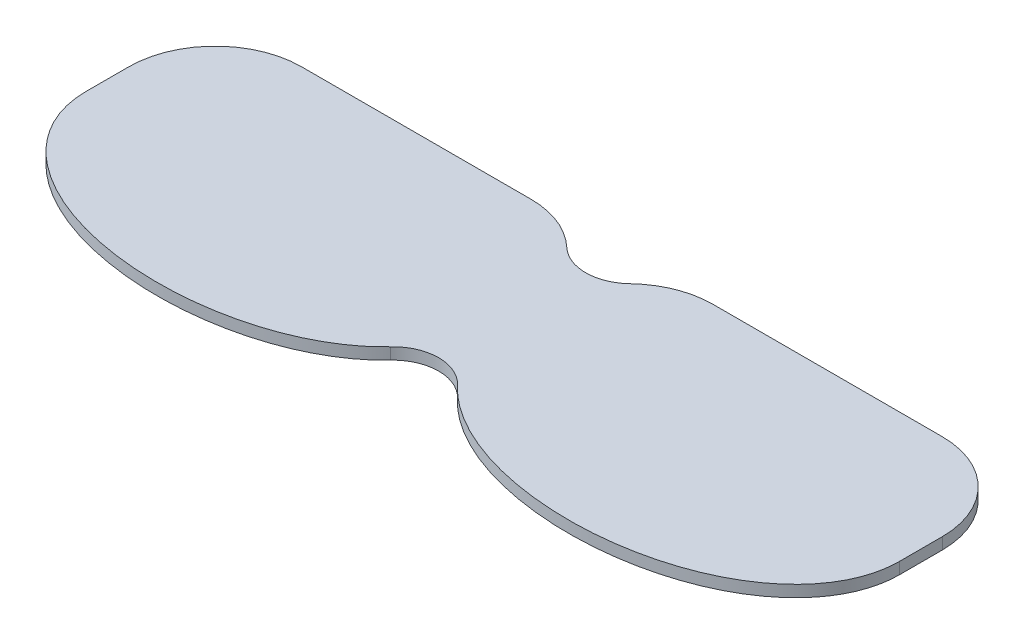
ISO-10303-21;
HEADER;
FILE_DESCRIPTION(('STEP AP214'),'2;1');
FILE_NAME('part.step','',(''),(''),'','','');
FILE_SCHEMA(('AUTOMOTIVE_DESIGN { 1 0 10303 214 1 1 1 1 }'));
ENDSEC;
DATA;
#1=APPLICATION_CONTEXT('core data for automotive mechanical design processes');
#2=APPLICATION_PROTOCOL_DEFINITION('international standard','automotive_design',2000,#1);
#3=PRODUCT_CONTEXT('',#1,'mechanical');
#4=PRODUCT('Part','Part','',(#3));
#5=PRODUCT_RELATED_PRODUCT_CATEGORY('part','',(#4));
#6=PRODUCT_DEFINITION_FORMATION('','',#4);
#7=PRODUCT_DEFINITION_CONTEXT('part definition',#1,'design');
#8=PRODUCT_DEFINITION('design','',#6,#7);
#9=PRODUCT_DEFINITION_SHAPE('','',#8);
#10=(LENGTH_UNIT() NAMED_UNIT(*) SI_UNIT(.MILLI.,.METRE.));
#11=(NAMED_UNIT(*) PLANE_ANGLE_UNIT() SI_UNIT($,.RADIAN.));
#12=(NAMED_UNIT(*) SI_UNIT($,.STERADIAN.) SOLID_ANGLE_UNIT());
#13=UNCERTAINTY_MEASURE_WITH_UNIT(LENGTH_MEASURE(1.E-05),#10,'distance_accuracy_value','');
#14=(GEOMETRIC_REPRESENTATION_CONTEXT(3) GLOBAL_UNCERTAINTY_ASSIGNED_CONTEXT((#13)) GLOBAL_UNIT_ASSIGNED_CONTEXT((#10,
#11,#12)) REPRESENTATION_CONTEXT('',''));
#15=CARTESIAN_POINT('',(0.,0.,0.));
#16=DIRECTION('',(0.,0.,1.));
#17=DIRECTION('',(1.,0.,0.));
#18=AXIS2_PLACEMENT_3D('',#15,#16,#17);
#19=CARTESIAN_POINT('',(-36.675,0.79375,-34.325));
#20=DIRECTION('',(0.,-1.,0.));
#21=DIRECTION('',(0.,0.,-1.));
#22=AXIS2_PLACEMENT_3D('',#19,#20,#21);
#23=CYLINDRICAL_SURFACE('',#22,5.675);
#24=CARTESIAN_POINT('',(-36.675,0.79375,-34.325));
#25=DIRECTION('',(0.,-1.,0.));
#26=DIRECTION('',(0.,0.,-1.));
#27=AXIS2_PLACEMENT_3D('',#24,#25,#26);
#28=CIRCLE('',#27,5.675);
#29=CARTESIAN_POINT('',(-36.675,0.79375,-40.));
#30=VERTEX_POINT('',#29);
#31=CARTESIAN_POINT('',(-32.7662824207493,0.79375,-38.4393106209493));
#32=VERTEX_POINT('',#31);
#33=EDGE_CURVE('E74',#30,#32,#28,.T.);
#34=ORIENTED_EDGE('',*,*,#33,.F.);
#35=DIRECTION('',(0.,-1.,0.));
#36=VECTOR('',#35,1.);
#37=CARTESIAN_POINT('',(-36.675,0.79375,-40.));
#38=LINE('',#37,#36);
#39=CARTESIAN_POINT('',(-36.675,1.55575,-40.));
#40=VERTEX_POINT('',#39);
#41=EDGE_CURVE('E68',#40,#30,#38,.T.);
#42=ORIENTED_EDGE('',*,*,#41,.F.);
#43=CARTESIAN_POINT('',(-36.675,1.55575,-34.325));
#44=DIRECTION('',(0.,1.,0.));
#45=DIRECTION('',(0.,0.,1.));
#46=AXIS2_PLACEMENT_3D('',#43,#44,#45);
#47=CIRCLE('',#46,5.675);
#48=CARTESIAN_POINT('',(-32.7662824207493,1.55575,-38.4393106209493));
#49=VERTEX_POINT('',#48);
#50=EDGE_CURVE('E154',#49,#40,#47,.T.);
#51=ORIENTED_EDGE('',*,*,#50,.F.);
#52=DIRECTION('',(0.,-1.,0.));
#53=VECTOR('',#52,1.);
#54=CARTESIAN_POINT('',(-32.7662824207493,0.79375,-38.4393106209493));
#55=LINE('',#54,#53);
#56=EDGE_CURVE('E158',#49,#32,#55,.T.);
#57=ORIENTED_EDGE('',*,*,#56,.T.);
#58=EDGE_LOOP('',(#34,#42,#51,#57));
#59=FACE_BOUND('',#58,.T.);
#60=ADVANCED_FACE('F61',(#59),#23,.T.);
#61=CARTESIAN_POINT('',(-36.675,0.79375,-40.));
#62=DIRECTION('',(0.,0.,1.));
#63=DIRECTION('',(1.,0.,0.));
#64=AXIS2_PLACEMENT_3D('',#61,#62,#63);
#65=PLANE('',#64);
#66=DIRECTION('',(1.,0.,0.));
#67=VECTOR('',#66,1.);
#68=CARTESIAN_POINT('',(-36.675,0.79375,-40.));
#69=LINE('',#68,#67);
#70=CARTESIAN_POINT('',(-51.725,0.79375,-40.));
#71=VERTEX_POINT('',#70);
#72=EDGE_CURVE('E219',#71,#30,#69,.T.);
#73=ORIENTED_EDGE('',*,*,#72,.F.);
#74=DIRECTION('',(0.,-1.,0.));
#75=VECTOR('',#74,1.);
#76=CARTESIAN_POINT('',(-51.725,0.79375,-40.));
#77=LINE('',#76,#75);
#78=CARTESIAN_POINT('',(-51.725,1.55575,-40.));
#79=VERTEX_POINT('',#78);
#80=EDGE_CURVE('E83',#79,#71,#77,.T.);
#81=ORIENTED_EDGE('',*,*,#80,.F.);
#82=DIRECTION('',(-1.,0.,0.));
#83=VECTOR('',#82,1.);
#84=CARTESIAN_POINT('',(-36.675,1.55575,-40.));
#85=LINE('',#84,#83);
#86=EDGE_CURVE('E157',#40,#79,#85,.T.);
#87=ORIENTED_EDGE('',*,*,#86,.F.);
#88=ORIENTED_EDGE('',*,*,#41,.T.);
#89=EDGE_LOOP('',(#73,#81,#87,#88));
#90=FACE_BOUND('',#89,.T.);
#91=ADVANCED_FACE('F205',(#90),#65,.F.);
#92=CARTESIAN_POINT('',(-51.725,0.79375,-34.325));
#93=DIRECTION('',(0.,-1.,0.));
#94=DIRECTION('',(0.,0.,-1.));
#95=AXIS2_PLACEMENT_3D('',#92,#93,#94);
#96=CYLINDRICAL_SURFACE('',#95,5.675);
#97=CARTESIAN_POINT('',(-51.725,0.79375,-34.325));
#98=DIRECTION('',(0.,-1.,0.));
#99=DIRECTION('',(0.,0.,-1.));
#100=AXIS2_PLACEMENT_3D('',#97,#98,#99);
#101=CIRCLE('',#100,5.675);
#102=CARTESIAN_POINT('',(-57.4,0.79375,-34.325));
#103=VERTEX_POINT('',#102);
#104=EDGE_CURVE('E270',#103,#71,#101,.T.);
#105=ORIENTED_EDGE('',*,*,#104,.F.);
#106=DIRECTION('',(0.,-1.,0.));
#107=VECTOR('',#106,1.);
#108=CARTESIAN_POINT('',(-57.4,0.79375,-34.325));
#109=LINE('',#108,#107);
#110=CARTESIAN_POINT('',(-57.4,1.55575,-34.325));
#111=VERTEX_POINT('',#110);
#112=EDGE_CURVE('E221',#111,#103,#109,.T.);
#113=ORIENTED_EDGE('',*,*,#112,.F.);
#114=CARTESIAN_POINT('',(-51.725,1.55575,-34.325));
#115=DIRECTION('',(0.,1.,0.));
#116=DIRECTION('',(0.,0.,1.));
#117=AXIS2_PLACEMENT_3D('',#114,#115,#116);
#118=CIRCLE('',#117,5.675);
#119=EDGE_CURVE('E218',#79,#111,#118,.T.);
#120=ORIENTED_EDGE('',*,*,#119,.F.);
#121=ORIENTED_EDGE('',*,*,#80,.T.);
#122=EDGE_LOOP('',(#105,#113,#120,#121));
#123=FACE_BOUND('',#122,.T.);
#124=ADVANCED_FACE('F210',(#123),#96,.T.);
#125=CARTESIAN_POINT('',(-57.4,0.79375,-34.325));
#126=DIRECTION('',(1.,0.,0.));
#127=DIRECTION('',(0.,0.,-1.));
#128=AXIS2_PLACEMENT_3D('',#125,#126,#127);
#129=PLANE('',#128);
#130=DIRECTION('',(0.,0.,-1.));
#131=VECTOR('',#130,1.);
#132=CARTESIAN_POINT('',(-57.4,0.79375,-34.325));
#133=LINE('',#132,#131);
#134=CARTESIAN_POINT('',(-57.4,0.79375,-31.5));
#135=VERTEX_POINT('',#134);
#136=EDGE_CURVE('E275',#135,#103,#133,.T.);
#137=ORIENTED_EDGE('',*,*,#136,.F.);
#138=DIRECTION('',(0.,-1.,0.));
#139=VECTOR('',#138,1.);
#140=CARTESIAN_POINT('',(-57.4,0.79375,-31.5));
#141=LINE('',#140,#139);
#142=CARTESIAN_POINT('',(-57.4,1.55575,-31.5));
#143=VERTEX_POINT('',#142);
#144=EDGE_CURVE('E117',#143,#135,#141,.T.);
#145=ORIENTED_EDGE('',*,*,#144,.F.);
#146=DIRECTION('',(0.,0.,1.));
#147=VECTOR('',#146,1.);
#148=CARTESIAN_POINT('',(-57.4,1.55575,-34.325));
#149=LINE('',#148,#147);
#150=EDGE_CURVE('E129',#111,#143,#149,.T.);
#151=ORIENTED_EDGE('',*,*,#150,.F.);
#152=ORIENTED_EDGE('',*,*,#112,.T.);
#153=EDGE_LOOP('',(#137,#145,#151,#152));
#154=FACE_BOUND('',#153,.T.);
#155=ADVANCED_FACE('F258',(#154),#129,.F.);
#156=CARTESIAN_POINT('',(-57.4,0.79375,-31.5));
#157=CARTESIAN_POINT('',(-57.4,0.79375,-30.8211542785592));
#158=CARTESIAN_POINT('',(-57.1531758961031,0.79375,-29.4471430814434));
#159=CARTESIAN_POINT('',(-56.1672129380606,0.79375,-27.6652704838865));
#160=CARTESIAN_POINT('',(-54.756272744858,0.79375,-26.2028137764362));
#161=CARTESIAN_POINT('',(-52.4554539835107,0.79375,-24.6429956011683));
#162=CARTESIAN_POINT('',(-48.9514289418349,0.79375,-23.3508154890305));
#163=CARTESIAN_POINT('',(-44.2,0.79375,-22.8245922554847));
#164=CARTESIAN_POINT('',(-39.4485710581651,0.79375,-23.3508154890305));
#165=CARTESIAN_POINT('',(-35.9445460164892,0.79375,-24.6429956011683));
#166=CARTESIAN_POINT('',(-34.0499031083979,0.79375,-25.9274507235496));
#167=CARTESIAN_POINT('',(-33.140035296487,0.79375,-26.7400402203476));
#168=CARTESIAN_POINT('',(-32.6582671373628,0.79375,-27.254488613723));
#169=CARTESIAN_POINT('',(-31.9565398898826,0.79375,-28.1624182814758));
#170=CARTESIAN_POINT('',(-31.2414114257777,0.79375,-29.4772741757112));
#171=CARTESIAN_POINT('',(-31.,0.79375,-30.8211542785592));
#172=CARTESIAN_POINT('',(-31.,0.79375,-31.5));
#173=B_SPLINE_CURVE_WITH_KNOTS('',3,(#156,#157,#158,#159,#160,#161,#162,#163,#164,#165,#166,
#167,#168,#169,#170,#171,#172),.UNSPECIFIED.,.F.,.F.,(4,1,1,1,1,1,1,1,1,1,1,1,1,1,4),(0.,
0.196349540849362,0.392699081698724,0.589048622548086,0.785398163397448,1.17809724509617,
1.5707963267949,1.96349540849362,2.35619449019234,2.55254403104171,2.61024302951772,
2.7084177999424,2.75750518515474,2.94524311274043,3.14159265358979),.UNSPECIFIED.);
#174=DIRECTION('',(0.,-1.,0.));
#175=VECTOR('',#174,1.);
#176=SURFACE_OF_LINEAR_EXTRUSION('',#173,#175);
#177=CARTESIAN_POINT('',(-57.4,0.79375,-31.5));
#178=CARTESIAN_POINT('',(-57.4,0.79375,-30.8211542785592));
#179=CARTESIAN_POINT('',(-57.1531758961031,0.79375,-29.4471430814434));
#180=CARTESIAN_POINT('',(-56.1672129380606,0.79375,-27.6652704838865));
#181=CARTESIAN_POINT('',(-54.756272744858,0.79375,-26.2028137764362));
#182=CARTESIAN_POINT('',(-52.4554539835107,0.79375,-24.6429956011683));
#183=CARTESIAN_POINT('',(-48.9514289418349,0.79375,-23.3508154890305));
#184=CARTESIAN_POINT('',(-44.2,0.79375,-22.8245922554847));
#185=CARTESIAN_POINT('',(-39.4485710581651,0.79375,-23.3508154890305));
#186=CARTESIAN_POINT('',(-35.9445460164892,0.79375,-24.6429956011683));
#187=CARTESIAN_POINT('',(-34.0499031083979,0.79375,-25.9274507235496));
#188=CARTESIAN_POINT('',(-33.140035296487,0.79375,-26.7400402203476));
#189=CARTESIAN_POINT('',(-32.6582671373628,0.79375,-27.254488613723));
#190=CARTESIAN_POINT('',(-31.9565398898826,0.79375,-28.1624182814758));
#191=CARTESIAN_POINT('',(-31.2414114257777,0.79375,-29.4772741757112));
#192=CARTESIAN_POINT('',(-31.,0.79375,-30.8211542785592));
#193=CARTESIAN_POINT('',(-31.,0.79375,-31.5));
#194=B_SPLINE_CURVE_WITH_KNOTS('',3,(#177,#178,#179,#180,#181,#182,#183,#184,#185,#186,#187,
#188,#189,#190,#191,#192,#193),.UNSPECIFIED.,.F.,.F.,(4,1,1,1,1,1,1,1,1,1,1,1,1,1,4),(0.,
0.196349540849362,0.392699081698724,0.589048622548086,0.785398163397448,1.17809724509617,
1.5707963267949,1.96349540849362,2.35619449019234,2.55254403104171,2.61024302951772,
2.7084177999424,2.75750518515474,2.94524311274043,3.14159265358979),.UNSPECIFIED.);
#195=CARTESIAN_POINT('',(-32.8929216775255,0.79375,-27.0112789099346));
#196=VERTEX_POINT('',#195);
#197=EDGE_CURVE('E113',#196,#135,#194,.F.);
#198=ORIENTED_EDGE('',*,*,#197,.F.);
#199=DIRECTION('',(0.,-1.,0.));
#200=VECTOR('',#199,1.);
#201=CARTESIAN_POINT('',(-32.8929216775254,0.79375,-27.0112789099346));
#202=LINE('',#201,#200);
#203=CARTESIAN_POINT('',(-32.8929216775255,1.55575,-27.0112789099345));
#204=VERTEX_POINT('',#203);
#205=EDGE_CURVE('E106',#204,#196,#202,.T.);
#206=ORIENTED_EDGE('',*,*,#205,.F.);
#207=CARTESIAN_POINT('',(-57.4,1.55575,-31.5));
#208=CARTESIAN_POINT('',(-57.3999623007137,1.55575,-31.3252708607774));
#209=CARTESIAN_POINT('',(-57.3918243320624,1.55575,-31.1506086252484));
#210=CARTESIAN_POINT('',(-57.3601097121256,1.55575,-30.802720331867));
#211=CARTESIAN_POINT('',(-57.336536426958,1.55575,-30.6294939692197));
#212=CARTESIAN_POINT('',(-57.2749227587732,1.55575,-30.2868725376511));
#213=CARTESIAN_POINT('',(-57.2369819402335,1.55575,-30.1174594161311));
#214=CARTESIAN_POINT('',(-57.1470701679043,1.55575,-29.7823962836938));
#215=CARTESIAN_POINT('',(-57.095099512376,1.55575,-29.6167461928592));
#216=CARTESIAN_POINT('',(-56.9774868771763,1.55575,-29.2906426934351));
#217=CARTESIAN_POINT('',(-56.9118640799397,1.55575,-29.1301823544744));
#218=CARTESIAN_POINT('',(-56.767992394323,1.55575,-28.8150472664316));
#219=CARTESIAN_POINT('',(-56.6897432500109,1.55575,-28.6603726347022));
#220=CARTESIAN_POINT('',(-56.5216482729126,1.55575,-28.3572029975685));
#221=CARTESIAN_POINT('',(-56.4317868639483,1.55575,-28.2087166532149));
#222=CARTESIAN_POINT('',(-56.2417054203192,1.55575,-27.9185368982846));
#223=CARTESIAN_POINT('',(-56.141484024052,1.55575,-27.7768443842054));
#224=CARTESIAN_POINT('',(-55.8867684190606,1.55575,-27.4412986348103));
#225=CARTESIAN_POINT('',(-55.7274208640722,1.55575,-27.2511124967391));
#226=CARTESIAN_POINT('',(-55.3925006278134,1.55575,-26.8856133475285));
#227=CARTESIAN_POINT('',(-55.2169223549027,1.55575,-26.7103055023012));
#228=CARTESIAN_POINT('',(-54.851962918912,1.55575,-26.3740583194901));
#229=CARTESIAN_POINT('',(-54.6625568472925,1.55575,-26.2131461340784));
#230=CARTESIAN_POINT('',(-54.2725405297848,1.55575,-25.9056050793752));
#231=CARTESIAN_POINT('',(-54.0719298227084,1.55575,-25.7589767986988));
#232=CARTESIAN_POINT('',(-53.5583100951328,1.55575,-25.4092712906654));
#233=CARTESIAN_POINT('',(-53.2394262209107,1.55575,-25.2148018939009));
#234=CARTESIAN_POINT('',(-52.5860506400821,1.55575,-24.8541379061701));
#235=CARTESIAN_POINT('',(-52.2515513530198,1.55575,-24.6879572336389));
#236=CARTESIAN_POINT('',(-51.5704056809973,1.55575,-24.3818850835421));
#237=CARTESIAN_POINT('',(-51.2237476889149,1.55575,-24.2420195850849));
#238=CARTESIAN_POINT('',(-50.5215691028626,1.55575,-23.9868887109347));
#239=CARTESIAN_POINT('',(-50.166048874664,1.55575,-23.8716223218336));
#240=CARTESIAN_POINT('',(-49.539037709294,1.55575,-23.6902091198535));
#241=CARTESIAN_POINT('',(-49.2689905251709,1.55575,-23.6190080446968));
#242=CARTESIAN_POINT('',(-48.725972207264,1.55575,-23.4887800325989));
#243=CARTESIAN_POINT('',(-48.4530007841272,1.55575,-23.4297543123328));
#244=CARTESIAN_POINT('',(-47.6304661226092,1.55575,-23.2701685587085));
#245=CARTESIAN_POINT('',(-47.0773867536247,1.55575,-23.1871295483157));
#246=CARTESIAN_POINT('',(-46.2432734764071,1.55575,-23.0957578894033));
#247=CARTESIAN_POINT('',(-45.9639035438929,1.55575,-23.0708148118588));
#248=CARTESIAN_POINT('',(-45.4043858907756,1.55575,-23.0319696017571));
#249=CARTESIAN_POINT('',(-45.1242381545942,1.55575,-23.0180676919628));
#250=CARTESIAN_POINT('',(-44.2834094964188,1.55575,-22.9928477829549));
#251=CARTESIAN_POINT('',(-43.7221273641035,1.55575,-22.9979921583824));
#252=CARTESIAN_POINT('',(-42.7789459230389,1.55575,-23.0436571667427));
#253=CARTESIAN_POINT('',(-42.3964197053069,1.55575,-23.0724828544567));
#254=CARTESIAN_POINT('',(-41.6334421566317,1.55575,-23.1510053541836));
#255=CARTESIAN_POINT('',(-41.252991002366,1.55575,-23.200703916124));
#256=CARTESIAN_POINT('',(-40.4954056759716,1.55575,-23.3216518936875));
#257=CARTESIAN_POINT('',(-40.1182724934665,1.55575,-23.392907528733));
#258=CARTESIAN_POINT('',(-39.3723487075302,1.55575,-23.5572282591912));
#259=CARTESIAN_POINT('',(-39.0035134203989,1.55575,-23.6500890404741));
#260=CARTESIAN_POINT('',(-38.2726655925702,1.55575,-23.8594283328898));
#261=CARTESIAN_POINT('',(-37.9106514226033,1.55575,-23.9759011239296));
#262=CARTESIAN_POINT('',(-37.1957914385389,1.55575,-24.2342510506902));
#263=CARTESIAN_POINT('',(-36.8429434459007,1.55575,-24.376122085526));
#264=CARTESIAN_POINT('',(-36.2746072680109,1.55575,-24.631121683492));
#265=CARTESIAN_POINT('',(-36.0554721399219,1.55575,-24.7361648541277));
#266=CARTESIAN_POINT('',(-35.6232942498862,1.55575,-24.9579152758129));
#267=CARTESIAN_POINT('',(-35.4102484642993,1.55575,-25.0746166039387));
#268=CARTESIAN_POINT('',(-34.991561664592,1.55575,-25.3202088013533));
#269=CARTESIAN_POINT('',(-34.7859134063662,1.55575,-25.449087271129));
#270=CARTESIAN_POINT('',(-34.3806169795858,1.55575,-25.7217598533578));
#271=CARTESIAN_POINT('',(-34.1810894646396,1.55575,-25.8657339782597));
#272=CARTESIAN_POINT('',(-33.7926272506553,1.55575,-26.1678346051313));
#273=CARTESIAN_POINT('',(-33.603703898891,1.55575,-26.3259758144506));
#274=CARTESIAN_POINT('',(-33.32975952645,1.55575,-26.5742924530176));
#275=CARTESIAN_POINT('',(-33.2398417636981,1.55575,-26.6591027631288));
#276=CARTESIAN_POINT('',(-33.0636014921275,1.55575,-26.832413079665));
#277=CARTESIAN_POINT('',(-32.9772797259761,1.55575,-26.9209138407868));
#278=CARTESIAN_POINT('',(-32.8929216775255,1.55575,-27.0112789099346));
#279=B_SPLINE_CURVE_WITH_KNOTS('',3,(#207,#208,#209,#210,#211,#212,#213,#214,#215,#216,#217,
#218,#219,#220,#221,#222,#223,#224,#225,#226,#227,#228,#229,#230,#231,#232,#233,#234,#235,#236,
#237,#238,#239,#240,#241,#242,#243,#244,#245,#246,#247,#248,#249,#250,#251,#252,#253,#254,#255,
#256,#257,#258,#259,#260,#261,#262,#263,#264,#265,#266,#267,#268,#269,#270,#271,#272,#273,#274,
#275,#276,#277,#278),.UNSPECIFIED.,.F.,.F.,(4,2,2,2,2,2,2,2,2,2,2,2,2,2,2,2,2,2,2,2,2,2,2,2,2,2,
2,2,2,2,2,2,2,2,2,4),(0.,0.523906082249319,1.04769794963615,1.56792455462904,2.08814010096391,
2.60762957756955,3.12712958538048,3.64733380466264,4.1676064809734,4.9108271519838,
5.65430483082275,6.39915647995763,7.14403881017296,8.26280519386121,9.38212044468083,
10.5025349836441,11.6229033560438,12.4604430998883,13.2980664980147,14.9736373978847,
15.8149139172584,16.6562074095172,18.3381450625312,19.4884880455216,20.6389274895454,
21.7896991634332,22.9300014366957,24.0700277970906,25.2097806795174,25.9385061072474,
26.6668631711345,27.3944864098923,28.132068970569,28.8704263169931,29.2411441754509,
29.6119382210761),.UNSPECIFIED.);
#280=EDGE_CURVE('E110',#143,#204,#279,.T.);
#281=ORIENTED_EDGE('',*,*,#280,.F.);
#282=ORIENTED_EDGE('',*,*,#144,.T.);
#283=EDGE_LOOP('',(#198,#206,#281,#282));
#284=FACE_BOUND('',#283,.T.);
#285=ADVANCED_FACE('F108',(#284),#176,.F.);
#286=CARTESIAN_POINT('',(-30.7,0.79375,-24.9640626252595));
#287=DIRECTION('',(0.,-1.,0.));
#288=DIRECTION('',(0.,0.,-1.));
#289=AXIS2_PLACEMENT_3D('',#286,#287,#288);
#290=CYLINDRICAL_SURFACE('',#289,3.);
#291=CARTESIAN_POINT('',(-30.7,0.79375,-24.9640626252595));
#292=DIRECTION('',(0.,-1.,0.));
#293=DIRECTION('',(0.,0.,-1.));
#294=AXIS2_PLACEMENT_3D('',#291,#292,#293);
#295=CIRCLE('',#294,3.);
#296=CARTESIAN_POINT('',(-28.5070783224744,0.79375,-27.0112789099344));
#297=VERTEX_POINT('',#296);
#298=EDGE_CURVE('E285',#297,#196,#295,.F.);
#299=ORIENTED_EDGE('',*,*,#298,.F.);
#300=DIRECTION('',(0.,-1.,0.));
#301=VECTOR('',#300,1.);
#302=CARTESIAN_POINT('',(-28.5070783224745,0.79375,-27.0112789099346));
#303=LINE('',#302,#301);
#304=CARTESIAN_POINT('',(-28.5070783224745,1.55575,-27.0112789099346));
#305=VERTEX_POINT('',#304);
#306=EDGE_CURVE('E118',#305,#297,#303,.T.);
#307=ORIENTED_EDGE('',*,*,#306,.F.);
#308=CARTESIAN_POINT('',(-30.7,1.55575,-24.9640626252595));
#309=DIRECTION('',(0.,-1.,0.));
#310=DIRECTION('',(0.,0.,1.));
#311=AXIS2_PLACEMENT_3D('',#308,#309,#310);
#312=CIRCLE('',#311,2.99999999999999);
#313=EDGE_CURVE('E126',#204,#305,#312,.T.);
#314=ORIENTED_EDGE('',*,*,#313,.F.);
#315=ORIENTED_EDGE('',*,*,#205,.T.);
#316=EDGE_LOOP('',(#299,#307,#314,#315));
#317=FACE_BOUND('',#316,.T.);
#318=ADVANCED_FACE('F131',(#317),#290,.F.);
#319=CARTESIAN_POINT('',(-30.4,0.79375,-31.5));
#320=CARTESIAN_POINT('',(-30.4,0.79375,-30.8211542785592));
#321=CARTESIAN_POINT('',(-30.1585885742223,0.79375,-29.4772741757112));
#322=CARTESIAN_POINT('',(-29.4434601101173,0.79375,-28.1624182814758));
#323=CARTESIAN_POINT('',(-28.7417328626372,0.79375,-27.254488613723));
#324=CARTESIAN_POINT('',(-28.259964703513,0.79375,-26.7400402203476));
#325=CARTESIAN_POINT('',(-27.3500968916021,0.79375,-25.9274507235495));
#326=CARTESIAN_POINT('',(-25.4554539835108,0.79375,-24.6429956011683));
#327=CARTESIAN_POINT('',(-21.9514289418349,0.79375,-23.3508154890305));
#328=CARTESIAN_POINT('',(-17.2,0.79375,-22.8245922554847));
#329=CARTESIAN_POINT('',(-12.4485710581651,0.79375,-23.3508154890305));
#330=CARTESIAN_POINT('',(-8.94454601648922,0.79375,-24.6429956011683));
#331=CARTESIAN_POINT('',(-6.64372725514197,0.79375,-26.2028137764362));
#332=CARTESIAN_POINT('',(-5.23278706193934,0.79375,-27.6652704838865));
#333=CARTESIAN_POINT('',(-4.24682410389684,0.79375,-29.4471430814434));
#334=CARTESIAN_POINT('',(-3.99999999999998,0.79375,-30.8211542785592));
#335=CARTESIAN_POINT('',(-3.99999999999998,0.79375,-31.5));
#336=B_SPLINE_CURVE_WITH_KNOTS('',3,(#319,#320,#321,#322,#323,#324,#325,#326,#327,#328,#329,
#330,#331,#332,#333,#334,#335),.UNSPECIFIED.,.F.,.F.,(4,1,1,1,1,1,1,1,1,1,1,1,1,1,4),(0.,
0.196349540849362,0.384087468435052,0.433174853647393,0.531349624072074,0.589048622548086,
0.785398163397448,1.17809724509617,1.5707963267949,1.96349540849362,2.35619449019234,
2.55254403104171,2.74889357189107,2.94524311274043,3.14159265358979),.UNSPECIFIED.);
#337=DIRECTION('',(0.,-1.,0.));
#338=VECTOR('',#337,1.);
#339=SURFACE_OF_LINEAR_EXTRUSION('',#336,#338);
#340=CARTESIAN_POINT('',(-30.4,0.79375,-31.5));
#341=CARTESIAN_POINT('',(-30.4,0.79375,-30.8211542785592));
#342=CARTESIAN_POINT('',(-30.1585885742223,0.79375,-29.4772741757112));
#343=CARTESIAN_POINT('',(-29.4434601101173,0.79375,-28.1624182814758));
#344=CARTESIAN_POINT('',(-28.7417328626372,0.79375,-27.254488613723));
#345=CARTESIAN_POINT('',(-28.259964703513,0.79375,-26.7400402203476));
#346=CARTESIAN_POINT('',(-27.3500968916021,0.79375,-25.9274507235495));
#347=CARTESIAN_POINT('',(-25.4554539835108,0.79375,-24.6429956011683));
#348=CARTESIAN_POINT('',(-21.9514289418349,0.79375,-23.3508154890305));
#349=CARTESIAN_POINT('',(-17.2,0.79375,-22.8245922554847));
#350=CARTESIAN_POINT('',(-12.4485710581651,0.79375,-23.3508154890305));
#351=CARTESIAN_POINT('',(-8.94454601648922,0.79375,-24.6429956011683));
#352=CARTESIAN_POINT('',(-6.64372725514197,0.79375,-26.2028137764362));
#353=CARTESIAN_POINT('',(-5.23278706193934,0.79375,-27.6652704838865));
#354=CARTESIAN_POINT('',(-4.24682410389684,0.79375,-29.4471430814434));
#355=CARTESIAN_POINT('',(-3.99999999999998,0.79375,-30.8211542785592));
#356=CARTESIAN_POINT('',(-3.99999999999998,0.79375,-31.5));
#357=B_SPLINE_CURVE_WITH_KNOTS('',3,(#340,#341,#342,#343,#344,#345,#346,#347,#348,#349,#350,
#351,#352,#353,#354,#355,#356),.UNSPECIFIED.,.F.,.F.,(4,1,1,1,1,1,1,1,1,1,1,1,1,1,4),(0.,
0.196349540849362,0.384087468435052,0.433174853647393,0.531349624072074,0.589048622548086,
0.785398163397448,1.17809724509617,1.5707963267949,1.96349540849362,2.35619449019234,
2.55254403104171,2.74889357189107,2.94524311274043,3.14159265358979),.UNSPECIFIED.);
#358=CARTESIAN_POINT('',(-3.99999999999998,0.79375,-31.5));
#359=VERTEX_POINT('',#358);
#360=EDGE_CURVE('E291',#359,#297,#357,.F.);
#361=ORIENTED_EDGE('',*,*,#360,.F.);
#362=DIRECTION('',(0.,-1.,0.));
#363=VECTOR('',#362,1.);
#364=CARTESIAN_POINT('',(-3.99999999999998,0.79375,-31.5));
#365=LINE('',#364,#363);
#366=CARTESIAN_POINT('',(-3.99999999999998,1.55575,-31.5));
#367=VERTEX_POINT('',#366);
#368=EDGE_CURVE('E228',#367,#359,#365,.T.);
#369=ORIENTED_EDGE('',*,*,#368,.F.);
#370=CARTESIAN_POINT('',(-28.5070783224745,1.55575,-27.0112789099346));
#371=CARTESIAN_POINT('',(-28.3884443511218,1.55575,-26.8841986836925));
#372=CARTESIAN_POINT('',(-28.2659295209096,1.55575,-26.760803715622));
#373=CARTESIAN_POINT('',(-28.0142460444183,1.55575,-26.5214727065007));
#374=CARTESIAN_POINT('',(-27.8850902584292,1.55575,-26.4055231593513));
#375=CARTESIAN_POINT('',(-27.6208552286275,1.55575,-26.1807590642442));
#376=CARTESIAN_POINT('',(-27.4857792652718,1.55575,-26.0719406461925));
#377=CARTESIAN_POINT('',(-27.211546850267,1.55575,-25.8621490044408));
#378=CARTESIAN_POINT('',(-27.0724364414205,1.55575,-25.761115469672));
#379=CARTESIAN_POINT('',(-26.7895859010865,1.55575,-25.5656099049701));
#380=CARTESIAN_POINT('',(-26.6458435674505,1.55575,-25.471141065511));
#381=CARTESIAN_POINT('',(-26.3543383898513,1.55575,-25.2885553927938));
#382=CARTESIAN_POINT('',(-26.2065742811745,1.55575,-25.2004405902135));
#383=CARTESIAN_POINT('',(-25.6946758182299,1.55575,-24.9091389626558));
#384=CARTESIAN_POINT('',(-25.3220231361711,1.55575,-24.7207403349029));
#385=CARTESIAN_POINT('',(-24.561862317276,1.55575,-24.3770157568532));
#386=CARTESIAN_POINT('',(-24.1743490976412,1.55575,-24.2217012436526));
#387=CARTESIAN_POINT('',(-23.3859851474497,1.55575,-23.9406360377687));
#388=CARTESIAN_POINT('',(-22.9850645814497,1.55575,-23.8150822283784));
#389=CARTESIAN_POINT('',(-22.1754911485083,1.55575,-23.5924779989027));
#390=CARTESIAN_POINT('',(-21.7668381241263,1.55575,-23.4954281598535));
#391=CARTESIAN_POINT('',(-20.7780242819045,1.55575,-23.2941077942231));
#392=CARTESIAN_POINT('',(-20.1951930907265,1.55575,-23.2027243097596));
#393=CARTESIAN_POINT('',(-19.3168676683099,1.55575,-23.1027570617086));
#394=CARTESIAN_POINT('',(-19.0233206321732,1.55575,-23.0756166399863));
#395=CARTESIAN_POINT('',(-18.43536027417,1.55575,-23.0335393411285));
#396=CARTESIAN_POINT('',(-18.1409469749531,1.55575,-23.0186021477195));
#397=CARTESIAN_POINT('',(-17.257772614085,1.55575,-22.9920128181107));
#398=CARTESIAN_POINT('',(-16.6683252988127,1.55575,-22.9984981587256));
#399=CARTESIAN_POINT('',(-15.7863730651649,1.55575,-23.044582569847));
#400=CARTESIAN_POINT('',(-15.492776341531,1.55575,-23.0660010626683));
#401=CARTESIAN_POINT('',(-14.9067241229627,1.55575,-23.121094580299));
#402=CARTESIAN_POINT('',(-14.61426860249,1.55575,-23.1547693292243));
#403=CARTESIAN_POINT('',(-13.880201362072,1.55575,-23.2552817828047));
#404=CARTESIAN_POINT('',(-13.4396755443235,1.55575,-23.330263525398));
#405=CARTESIAN_POINT('',(-12.5647756210005,1.55575,-23.5104098538031));
#406=CARTESIAN_POINT('',(-12.1304018582279,1.55575,-23.615576114653));
#407=CARTESIAN_POINT('',(-11.2715463408567,1.55575,-23.8581695111531));
#408=CARTESIAN_POINT('',(-10.8470477511087,1.55575,-23.9955365192014));
#409=CARTESIAN_POINT('',(-10.0111571586834,1.55575,-24.3054918475502));
#410=CARTESIAN_POINT('',(-9.59975872467004,1.55575,-24.4780625669937));
#411=CARTESIAN_POINT('',(-8.94676429672025,1.55575,-24.7894331786494));
#412=CARTESIAN_POINT('',(-8.69955729377479,1.55575,-24.9164834686431));
#413=CARTESIAN_POINT('',(-8.21394260256683,1.55575,-25.1862505203341));
#414=CARTESIAN_POINT('',(-7.97553461276868,1.55575,-25.3289667445041));
#415=CARTESIAN_POINT('',(-7.27689029557292,1.55575,-25.7823621374725));
#416=CARTESIAN_POINT('',(-6.83233743177635,1.55575,-26.1187004803013));
#417=CARTESIAN_POINT('',(-6.26350831264087,1.55575,-26.6342649912314));
#418=CARTESIAN_POINT('',(-6.1106599798484,1.55575,-26.7826126526607));
#419=CARTESIAN_POINT('',(-5.81638310063665,1.55575,-27.0903278973407));
#420=CARTESIAN_POINT('',(-5.6749540307336,1.55575,-27.2496949748149));
#421=CARTESIAN_POINT('',(-5.40545515408859,1.55575,-27.5790946028017));
#422=CARTESIAN_POINT('',(-5.27737174975479,1.55575,-27.7491160092421));
#423=CARTESIAN_POINT('',(-5.03623895086168,1.55575,-28.0995274122298));
#424=CARTESIAN_POINT('',(-4.92318699903969,1.55575,-28.2799156375984));
#425=CARTESIAN_POINT('',(-4.73176112884194,1.55575,-28.6193029935693));
#426=CARTESIAN_POINT('',(-4.65075104738033,1.55575,-28.7768165653571));
#427=CARTESIAN_POINT('',(-4.50182456388289,1.55575,-29.0979322574115));
#428=CARTESIAN_POINT('',(-4.43390692536928,1.55575,-29.2615338009745));
#429=CARTESIAN_POINT('',(-4.31242982969873,1.55575,-29.5937526907887));
#430=CARTESIAN_POINT('',(-4.25885200913164,1.55575,-29.7623633118951));
#431=CARTESIAN_POINT('',(-4.16627147216282,1.55575,-30.1034906682859));
#432=CARTESIAN_POINT('',(-4.12726520955796,1.55575,-30.2760064423404));
#433=CARTESIAN_POINT('',(-4.06439184618105,1.55575,-30.6230919878517));
#434=CARTESIAN_POINT('',(-4.04046561441233,1.55575,-30.797650968184));
#435=CARTESIAN_POINT('',(-4.00829244654596,1.55575,-31.1481171350692));
#436=CARTESIAN_POINT('',(-4.00003830108536,1.55575,-31.3240236643227));
#437=CARTESIAN_POINT('',(-3.99999999999998,1.55575,-31.5));
#438=B_SPLINE_CURVE_WITH_KNOTS('',3,(#370,#371,#372,#373,#374,#375,#376,#377,#378,#379,#380,
#381,#382,#383,#384,#385,#386,#387,#388,#389,#390,#391,#392,#393,#394,#395,#396,#397,#398,#399,
#400,#401,#402,#403,#404,#405,#406,#407,#408,#409,#410,#411,#412,#413,#414,#415,#416,#417,#418,
#419,#420,#421,#422,#423,#424,#425,#426,#427,#428,#429,#430,#431,#432,#433,#434,#435,#436,#437),
.UNSPECIFIED.,.F.,.F.,(4,2,2,2,2,2,2,2,2,2,2,2,2,2,2,2,2,2,2,2,2,2,2,2,2,2,2,2,2,2,2,2,2,4),(0.,
0.521397574298677,1.04182092458314,1.56195945904667,2.07754704150844,2.59338347446494,
3.1093840388673,4.36006942593023,5.61118647265639,6.87036272816856,8.12956464943911,
9.89684900032871,10.7810424802135,11.6652130435559,13.4312911340659,14.3142241424724,
15.1971372775909,16.5366864852697,17.8763100433051,19.2134518081176,20.5499266713147,
21.3831905275275,22.2164258018407,23.8799581450592,24.5185347177704,25.1570820001069,
25.7949721849947,26.4327537080134,26.9635890599592,27.4943742541136,28.024476442709,
28.5544495389601,29.082331388984,29.6099703476222),.UNSPECIFIED.);
#439=EDGE_CURVE('E133',#305,#367,#438,.T.);
#440=ORIENTED_EDGE('',*,*,#439,.F.);
#441=ORIENTED_EDGE('',*,*,#306,.T.);
#442=EDGE_LOOP('',(#361,#369,#440,#441));
#443=FACE_BOUND('',#442,.T.);
#444=ADVANCED_FACE('F169',(#443),#339,.F.);
#445=CARTESIAN_POINT('',(-3.99999999999998,0.79375,-31.5));
#446=DIRECTION('',(-1.,0.,0.));
#447=DIRECTION('',(0.,0.,1.));
#448=AXIS2_PLACEMENT_3D('',#445,#446,#447);
#449=PLANE('',#448);
#450=DIRECTION('',(0.,0.,1.));
#451=VECTOR('',#450,1.);
#452=CARTESIAN_POINT('',(-3.99999999999998,0.79375,-31.5));
#453=LINE('',#452,#451);
#454=CARTESIAN_POINT('',(-3.99999999999999,0.79375,-34.325));
#455=VERTEX_POINT('',#454);
#456=EDGE_CURVE('E296',#455,#359,#453,.T.);
#457=ORIENTED_EDGE('',*,*,#456,.F.);
#458=DIRECTION('',(0.,-1.,0.));
#459=VECTOR('',#458,1.);
#460=CARTESIAN_POINT('',(-3.99999999999999,0.79375,-34.325));
#461=LINE('',#460,#459);
#462=CARTESIAN_POINT('',(-3.99999999999999,1.55575,-34.325));
#463=VERTEX_POINT('',#462);
#464=EDGE_CURVE('E231',#463,#455,#461,.T.);
#465=ORIENTED_EDGE('',*,*,#464,.F.);
#466=DIRECTION('',(0.,0.,-1.));
#467=VECTOR('',#466,1.);
#468=CARTESIAN_POINT('',(-3.99999999999998,1.55575,-31.5));
#469=LINE('',#468,#467);
#470=EDGE_CURVE('E135',#367,#463,#469,.T.);
#471=ORIENTED_EDGE('',*,*,#470,.F.);
#472=ORIENTED_EDGE('',*,*,#368,.T.);
#473=EDGE_LOOP('',(#457,#465,#471,#472));
#474=FACE_BOUND('',#473,.T.);
#475=ADVANCED_FACE('F195',(#474),#449,.F.);
#476=CARTESIAN_POINT('',(-9.67499999999999,0.79375,-34.325));
#477=DIRECTION('',(0.,-1.,0.));
#478=DIRECTION('',(0.,0.,-1.));
#479=AXIS2_PLACEMENT_3D('',#476,#477,#478);
#480=CYLINDRICAL_SURFACE('',#479,5.67500000000001);
#481=CARTESIAN_POINT('',(-9.67499999999999,0.79375,-34.325));
#482=DIRECTION('',(0.,-1.,0.));
#483=DIRECTION('',(0.,0.,-1.));
#484=AXIS2_PLACEMENT_3D('',#481,#482,#483);
#485=CIRCLE('',#484,5.67500000000001);
#486=CARTESIAN_POINT('',(-9.67499999999999,0.79375,-40.));
#487=VERTEX_POINT('',#486);
#488=EDGE_CURVE('E302',#487,#455,#485,.T.);
#489=ORIENTED_EDGE('',*,*,#488,.F.);
#490=DIRECTION('',(0.,-1.,0.));
#491=VECTOR('',#490,1.);
#492=CARTESIAN_POINT('',(-9.67499999999999,0.79375,-40.));
#493=LINE('',#492,#491);
#494=CARTESIAN_POINT('',(-9.67499999999999,1.55575,-40.));
#495=VERTEX_POINT('',#494);
#496=EDGE_CURVE('E234',#495,#487,#493,.T.);
#497=ORIENTED_EDGE('',*,*,#496,.F.);
#498=CARTESIAN_POINT('',(-9.67499999999999,1.55575,-34.325));
#499=DIRECTION('',(0.,1.,0.));
#500=DIRECTION('',(0.,0.,1.));
#501=AXIS2_PLACEMENT_3D('',#498,#499,#500);
#502=CIRCLE('',#501,5.67500000000001);
#503=EDGE_CURVE('E142',#463,#495,#502,.T.);
#504=ORIENTED_EDGE('',*,*,#503,.F.);
#505=ORIENTED_EDGE('',*,*,#464,.T.);
#506=EDGE_LOOP('',(#489,#497,#504,#505));
#507=FACE_BOUND('',#506,.T.);
#508=ADVANCED_FACE('F192',(#507),#480,.T.);
#509=CARTESIAN_POINT('',(-9.67499999999999,0.79375,-40.));
#510=DIRECTION('',(0.,0.,1.));
#511=DIRECTION('',(1.,0.,0.));
#512=AXIS2_PLACEMENT_3D('',#509,#510,#511);
#513=PLANE('',#512);
#514=DIRECTION('',(1.,0.,0.));
#515=VECTOR('',#514,1.);
#516=CARTESIAN_POINT('',(-9.67499999999999,0.79375,-40.));
#517=LINE('',#516,#515);
#518=CARTESIAN_POINT('',(-24.725,0.79375,-40.));
#519=VERTEX_POINT('',#518);
#520=EDGE_CURVE('E305',#519,#487,#517,.T.);
#521=ORIENTED_EDGE('',*,*,#520,.F.);
#522=DIRECTION('',(0.,-1.,0.));
#523=VECTOR('',#522,1.);
#524=CARTESIAN_POINT('',(-24.725,0.79375,-40.));
#525=LINE('',#524,#523);
#526=CARTESIAN_POINT('',(-24.725,1.55575,-40.));
#527=VERTEX_POINT('',#526);
#528=EDGE_CURVE('E237',#527,#519,#525,.T.);
#529=ORIENTED_EDGE('',*,*,#528,.F.);
#530=DIRECTION('',(-1.,0.,0.));
#531=VECTOR('',#530,1.);
#532=CARTESIAN_POINT('',(-9.67499999999999,1.55575,-40.));
#533=LINE('',#532,#531);
#534=EDGE_CURVE('E145',#495,#527,#533,.T.);
#535=ORIENTED_EDGE('',*,*,#534,.F.);
#536=ORIENTED_EDGE('',*,*,#496,.T.);
#537=EDGE_LOOP('',(#521,#529,#535,#536));
#538=FACE_BOUND('',#537,.T.);
#539=ADVANCED_FACE('F188',(#538),#513,.F.);
#540=CARTESIAN_POINT('',(-24.725,0.79375,-34.325));
#541=DIRECTION('',(0.,-1.,0.));
#542=DIRECTION('',(0.,0.,-1.));
#543=AXIS2_PLACEMENT_3D('',#540,#541,#542);
#544=CYLINDRICAL_SURFACE('',#543,5.67500000000001);
#545=CARTESIAN_POINT('',(-24.725,0.79375,-34.325));
#546=DIRECTION('',(0.,-1.,0.));
#547=DIRECTION('',(0.,0.,-1.));
#548=AXIS2_PLACEMENT_3D('',#545,#546,#547);
#549=CIRCLE('',#548,5.67500000000001);
#550=CARTESIAN_POINT('',(-28.6337175792507,0.79375,-38.4393106209493));
#551=VERTEX_POINT('',#550);
#552=EDGE_CURVE('E308',#551,#519,#549,.T.);
#553=ORIENTED_EDGE('',*,*,#552,.F.);
#554=DIRECTION('',(0.,-1.,0.));
#555=VECTOR('',#554,1.);
#556=CARTESIAN_POINT('',(-28.6337175792507,0.79375,-38.4393106209493));
#557=LINE('',#556,#555);
#558=CARTESIAN_POINT('',(-28.6337175792507,1.55575,-38.4393106209493));
#559=VERTEX_POINT('',#558);
#560=EDGE_CURVE('E240',#559,#551,#557,.T.);
#561=ORIENTED_EDGE('',*,*,#560,.F.);
#562=CARTESIAN_POINT('',(-24.725,1.55575,-34.325));
#563=DIRECTION('',(0.,1.,0.));
#564=DIRECTION('',(0.,0.,1.));
#565=AXIS2_PLACEMENT_3D('',#562,#563,#564);
#566=CIRCLE('',#565,5.67500000000001);
#567=EDGE_CURVE('E148',#527,#559,#566,.T.);
#568=ORIENTED_EDGE('',*,*,#567,.F.);
#569=ORIENTED_EDGE('',*,*,#528,.T.);
#570=EDGE_LOOP('',(#553,#561,#568,#569));
#571=FACE_BOUND('',#570,.T.);
#572=ADVANCED_FACE('F184',(#571),#544,.T.);
#573=CARTESIAN_POINT('',(-30.7,0.79375,-40.614276587971));
#574=DIRECTION('',(0.,-1.,0.));
#575=DIRECTION('',(0.,0.,-1.));
#576=AXIS2_PLACEMENT_3D('',#573,#574,#575);
#577=CYLINDRICAL_SURFACE('',#576,3.);
#578=CARTESIAN_POINT('',(-30.7,0.79375,-40.614276587971));
#579=DIRECTION('',(0.,-1.,0.));
#580=DIRECTION('',(0.,0.,-1.));
#581=AXIS2_PLACEMENT_3D('',#578,#579,#580);
#582=CIRCLE('',#581,3.);
#583=EDGE_CURVE('E12',#32,#551,#582,.F.);
#584=ORIENTED_EDGE('',*,*,#583,.F.);
#585=ORIENTED_EDGE('',*,*,#56,.F.);
#586=CARTESIAN_POINT('',(-30.7,1.55575,-40.614276587971));
#587=DIRECTION('',(0.,-1.,0.));
#588=DIRECTION('',(0.,0.,1.));
#589=AXIS2_PLACEMENT_3D('',#586,#587,#588);
#590=CIRCLE('',#589,3.);
#591=EDGE_CURVE('E151',#559,#49,#590,.T.);
#592=ORIENTED_EDGE('',*,*,#591,.F.);
#593=ORIENTED_EDGE('',*,*,#560,.T.);
#594=EDGE_LOOP('',(#584,#585,#592,#593));
#595=FACE_BOUND('',#594,.T.);
#596=ADVANCED_FACE('F178',(#595),#577,.F.);
#597=CARTESIAN_POINT('',(-51.725,1.55575,-34.325));
#598=DIRECTION('',(0.,1.,0.));
#599=DIRECTION('',(0.,0.,1.));
#600=AXIS2_PLACEMENT_3D('',#597,#598,#599);
#601=PLANE('',#600);
#602=ORIENTED_EDGE('',*,*,#119,.T.);
#603=ORIENTED_EDGE('',*,*,#150,.T.);
#604=ORIENTED_EDGE('',*,*,#280,.T.);
#605=ORIENTED_EDGE('',*,*,#313,.T.);
#606=ORIENTED_EDGE('',*,*,#439,.T.);
#607=ORIENTED_EDGE('',*,*,#470,.T.);
#608=ORIENTED_EDGE('',*,*,#503,.T.);
#609=ORIENTED_EDGE('',*,*,#534,.T.);
#610=ORIENTED_EDGE('',*,*,#567,.T.);
#611=ORIENTED_EDGE('',*,*,#591,.T.);
#612=ORIENTED_EDGE('',*,*,#50,.T.);
#613=ORIENTED_EDGE('',*,*,#86,.T.);
#614=EDGE_LOOP('',(#602,#603,#604,#605,#606,#607,#608,#609,#610,#611,#612,#613));
#615=FACE_BOUND('',#614,.T.);
#616=ADVANCED_FACE('F124',(#615),#601,.T.);
#617=CARTESIAN_POINT('',(-51.725,0.79375,-34.325));
#618=DIRECTION('',(0.,1.,0.));
#619=DIRECTION('',(0.,0.,1.));
#620=AXIS2_PLACEMENT_3D('',#617,#618,#619);
#621=PLANE('',#620);
#622=ORIENTED_EDGE('',*,*,#33,.T.);
#623=ORIENTED_EDGE('',*,*,#583,.T.);
#624=ORIENTED_EDGE('',*,*,#552,.T.);
#625=ORIENTED_EDGE('',*,*,#520,.T.);
#626=ORIENTED_EDGE('',*,*,#488,.T.);
#627=ORIENTED_EDGE('',*,*,#456,.T.);
#628=ORIENTED_EDGE('',*,*,#360,.T.);
#629=ORIENTED_EDGE('',*,*,#298,.T.);
#630=ORIENTED_EDGE('',*,*,#197,.T.);
#631=ORIENTED_EDGE('',*,*,#136,.T.);
#632=ORIENTED_EDGE('',*,*,#104,.T.);
#633=ORIENTED_EDGE('',*,*,#72,.T.);
#634=EDGE_LOOP('',(#622,#623,#624,#625,#626,#627,#628,#629,#630,#631,#632,#633));
#635=FACE_BOUND('',#634,.T.);
#636=ADVANCED_FACE('F177',(#635),#621,.F.);
#637=CLOSED_SHELL('',(#60,#91,#124,#155,#285,#318,#444,#475,#508,#539,#572,#596,#616,#636));
#638=MANIFOLD_SOLID_BREP('B2',#637);
#639=ADVANCED_BREP_SHAPE_REPRESENTATION('',(#18,#638),#14);
#640=SHAPE_DEFINITION_REPRESENTATION(#9,#639);
ENDSEC;
END-ISO-10303-21;
